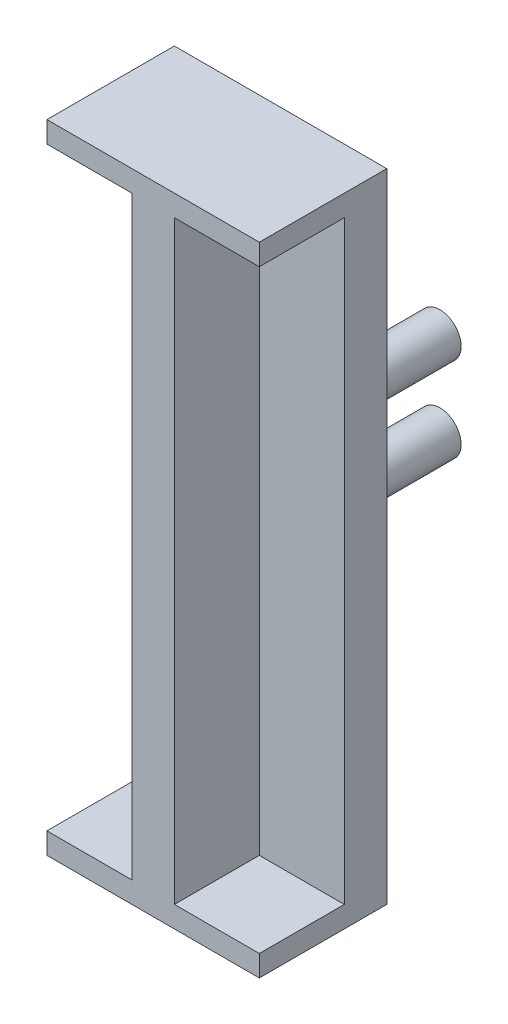
ISO-10303-21;
HEADER;
FILE_DESCRIPTION(('STEP AP214'),'2;1');
FILE_NAME('part.step','',(''),(''),'','','');
FILE_SCHEMA(('AUTOMOTIVE_DESIGN { 1 0 10303 214 1 1 1 1 }'));
ENDSEC;
DATA;
#1=APPLICATION_CONTEXT('core data for automotive mechanical design processes');
#2=APPLICATION_PROTOCOL_DEFINITION('international standard','automotive_design',2000,#1);
#3=PRODUCT_CONTEXT('',#1,'mechanical');
#4=PRODUCT('Part','Part','',(#3));
#5=PRODUCT_RELATED_PRODUCT_CATEGORY('part','',(#4));
#6=PRODUCT_DEFINITION_FORMATION('','',#4);
#7=PRODUCT_DEFINITION_CONTEXT('part definition',#1,'design');
#8=PRODUCT_DEFINITION('design','',#6,#7);
#9=PRODUCT_DEFINITION_SHAPE('','',#8);
#10=(LENGTH_UNIT() NAMED_UNIT(*) SI_UNIT(.MILLI.,.METRE.));
#11=(NAMED_UNIT(*) PLANE_ANGLE_UNIT() SI_UNIT($,.RADIAN.));
#12=(NAMED_UNIT(*) SI_UNIT($,.STERADIAN.) SOLID_ANGLE_UNIT());
#13=UNCERTAINTY_MEASURE_WITH_UNIT(LENGTH_MEASURE(1.E-05),#10,'distance_accuracy_value','');
#14=(GEOMETRIC_REPRESENTATION_CONTEXT(3) GLOBAL_UNCERTAINTY_ASSIGNED_CONTEXT((#13)) GLOBAL_UNIT_ASSIGNED_CONTEXT((#10,
#11,#12)) REPRESENTATION_CONTEXT('',''));
#15=CARTESIAN_POINT('',(0.,0.,0.));
#16=DIRECTION('',(0.,0.,1.));
#17=DIRECTION('',(1.,0.,0.));
#18=AXIS2_PLACEMENT_3D('',#15,#16,#17);
#19=CARTESIAN_POINT('',(0.,0.,2.));
#20=DIRECTION('',(0.,0.,-1.));
#21=DIRECTION('',(-1.,0.,0.));
#22=AXIS2_PLACEMENT_3D('',#19,#20,#21);
#23=PLANE('',#22);
#24=DIRECTION('',(0.,1.,0.));
#25=VECTOR('',#24,1.);
#26=CARTESIAN_POINT('',(5.,15.,2.));
#27=LINE('',#26,#25);
#28=CARTESIAN_POINT('',(5.,-14.,2.));
#29=VERTEX_POINT('',#28);
#30=CARTESIAN_POINT('',(5.,14.,2.));
#31=VERTEX_POINT('',#30);
#32=EDGE_CURVE('E203',#29,#31,#27,.T.);
#33=ORIENTED_EDGE('',*,*,#32,.T.);
#34=DIRECTION('',(-1.,0.,0.));
#35=VECTOR('',#34,1.);
#36=CARTESIAN_POINT('',(0.,14.,2.));
#37=LINE('',#36,#35);
#38=CARTESIAN_POINT('',(1.,14.,2.));
#39=VERTEX_POINT('',#38);
#40=EDGE_CURVE('E49',#31,#39,#37,.T.);
#41=ORIENTED_EDGE('',*,*,#40,.T.);
#42=DIRECTION('',(0.,-1.,0.));
#43=VECTOR('',#42,1.);
#44=CARTESIAN_POINT('',(1.,0.,2.));
#45=LINE('',#44,#43);
#46=CARTESIAN_POINT('',(1.,-14.,2.));
#47=VERTEX_POINT('',#46);
#48=EDGE_CURVE('E54',#39,#47,#45,.T.);
#49=ORIENTED_EDGE('',*,*,#48,.T.);
#50=DIRECTION('',(1.,0.,0.));
#51=VECTOR('',#50,1.);
#52=CARTESIAN_POINT('',(0.,-14.,2.));
#53=LINE('',#52,#51);
#54=EDGE_CURVE('E182',#47,#29,#53,.T.);
#55=ORIENTED_EDGE('',*,*,#54,.T.);
#56=EDGE_LOOP('',(#33,#41,#49,#55));
#57=FACE_BOUND('',#56,.T.);
#58=ADVANCED_FACE('F34',(#57),#23,.F.);
#59=CARTESIAN_POINT('',(-5.,15.,2.));
#60=DIRECTION('',(1.,0.,0.));
#61=DIRECTION('',(0.,1.,0.));
#62=AXIS2_PLACEMENT_3D('',#59,#60,#61);
#63=PLANE('',#62);
#64=DIRECTION('',(0.,-1.,0.));
#65=VECTOR('',#64,1.);
#66=CARTESIAN_POINT('',(-5.,15.,0.));
#67=LINE('',#66,#65);
#68=CARTESIAN_POINT('',(-5.,15.,0.));
#69=VERTEX_POINT('',#68);
#70=CARTESIAN_POINT('',(-5.,-15.,0.));
#71=VERTEX_POINT('',#70);
#72=EDGE_CURVE('E132',#69,#71,#67,.T.);
#73=ORIENTED_EDGE('',*,*,#72,.T.);
#74=DIRECTION('',(0.,0.,-1.));
#75=VECTOR('',#74,1.);
#76=CARTESIAN_POINT('',(-5.,-15.,2.));
#77=LINE('',#76,#75);
#78=CARTESIAN_POINT('',(-5.,-15.,6.));
#79=VERTEX_POINT('',#78);
#80=EDGE_CURVE('E11',#79,#71,#77,.T.);
#81=ORIENTED_EDGE('',*,*,#80,.F.);
#82=DIRECTION('',(0.,-1.,0.));
#83=VECTOR('',#82,1.);
#84=CARTESIAN_POINT('',(-5.,0.,6.));
#85=LINE('',#84,#83);
#86=CARTESIAN_POINT('',(-5.,-14.,6.));
#87=VERTEX_POINT('',#86);
#88=EDGE_CURVE('E156',#87,#79,#85,.T.);
#89=ORIENTED_EDGE('',*,*,#88,.F.);
#90=DIRECTION('',(0.,0.,-1.));
#91=VECTOR('',#90,1.);
#92=CARTESIAN_POINT('',(-5.,-14.,6.));
#93=LINE('',#92,#91);
#94=CARTESIAN_POINT('',(-5.,-14.,2.));
#95=VERTEX_POINT('',#94);
#96=EDGE_CURVE('E197',#87,#95,#93,.T.);
#97=ORIENTED_EDGE('',*,*,#96,.T.);
#98=DIRECTION('',(0.,-1.,0.));
#99=VECTOR('',#98,1.);
#100=CARTESIAN_POINT('',(-5.,15.,2.));
#101=LINE('',#100,#99);
#102=CARTESIAN_POINT('',(-5.,14.,2.));
#103=VERTEX_POINT('',#102);
#104=EDGE_CURVE('E201',#103,#95,#101,.T.);
#105=ORIENTED_EDGE('',*,*,#104,.F.);
#106=DIRECTION('',(0.,0.,-1.));
#107=VECTOR('',#106,1.);
#108=CARTESIAN_POINT('',(-5.,14.,6.));
#109=LINE('',#108,#107);
#110=CARTESIAN_POINT('',(-5.,14.,6.));
#111=VERTEX_POINT('',#110);
#112=EDGE_CURVE('E185',#111,#103,#109,.T.);
#113=ORIENTED_EDGE('',*,*,#112,.F.);
#114=CARTESIAN_POINT('',(-5.,15.,6.));
#115=VERTEX_POINT('',#114);
#116=EDGE_CURVE('E147',#115,#111,#85,.T.);
#117=ORIENTED_EDGE('',*,*,#116,.F.);
#118=DIRECTION('',(0.,0.,-1.));
#119=VECTOR('',#118,1.);
#120=CARTESIAN_POINT('',(-5.,15.,2.));
#121=LINE('',#120,#119);
#122=EDGE_CURVE('E206',#115,#69,#121,.T.);
#123=ORIENTED_EDGE('',*,*,#122,.T.);
#124=EDGE_LOOP('',(#73,#81,#89,#97,#105,#113,#117,#123));
#125=FACE_BOUND('',#124,.T.);
#126=ADVANCED_FACE('F36',(#125),#63,.F.);
#127=CARTESIAN_POINT('',(5.,-15.,2.));
#128=DIRECTION('',(0.,1.,0.));
#129=DIRECTION('',(0.,0.,1.));
#130=AXIS2_PLACEMENT_3D('',#127,#128,#129);
#131=PLANE('',#130);
#132=DIRECTION('',(1.,0.,0.));
#133=VECTOR('',#132,1.);
#134=CARTESIAN_POINT('',(5.,-15.,0.));
#135=LINE('',#134,#133);
#136=CARTESIAN_POINT('',(5.,-15.,0.));
#137=VERTEX_POINT('',#136);
#138=EDGE_CURVE('E209',#71,#137,#135,.T.);
#139=ORIENTED_EDGE('',*,*,#138,.T.);
#140=DIRECTION('',(0.,0.,-1.));
#141=VECTOR('',#140,1.);
#142=CARTESIAN_POINT('',(5.,-15.,2.));
#143=LINE('',#142,#141);
#144=CARTESIAN_POINT('',(5.,-15.,6.));
#145=VERTEX_POINT('',#144);
#146=EDGE_CURVE('E42',#145,#137,#143,.T.);
#147=ORIENTED_EDGE('',*,*,#146,.F.);
#148=DIRECTION('',(1.,0.,0.));
#149=VECTOR('',#148,1.);
#150=CARTESIAN_POINT('',(0.,-15.,6.));
#151=LINE('',#150,#149);
#152=EDGE_CURVE('E159',#79,#145,#151,.T.);
#153=ORIENTED_EDGE('',*,*,#152,.F.);
#154=ORIENTED_EDGE('',*,*,#80,.T.);
#155=EDGE_LOOP('',(#139,#147,#153,#154));
#156=FACE_BOUND('',#155,.T.);
#157=ADVANCED_FACE('F241',(#156),#131,.F.);
#158=CARTESIAN_POINT('',(5.,15.,2.));
#159=DIRECTION('',(-1.,0.,0.));
#160=DIRECTION('',(0.,-1.,0.));
#161=AXIS2_PLACEMENT_3D('',#158,#159,#160);
#162=PLANE('',#161);
#163=DIRECTION('',(0.,1.,0.));
#164=VECTOR('',#163,1.);
#165=CARTESIAN_POINT('',(5.,15.,0.));
#166=LINE('',#165,#164);
#167=CARTESIAN_POINT('',(5.,15.,0.));
#168=VERTEX_POINT('',#167);
#169=EDGE_CURVE('E211',#137,#168,#166,.T.);
#170=ORIENTED_EDGE('',*,*,#169,.T.);
#171=DIRECTION('',(0.,0.,-1.));
#172=VECTOR('',#171,1.);
#173=CARTESIAN_POINT('',(5.,15.,2.));
#174=LINE('',#173,#172);
#175=CARTESIAN_POINT('',(5.,15.,6.));
#176=VERTEX_POINT('',#175);
#177=EDGE_CURVE('E216',#176,#168,#174,.T.);
#178=ORIENTED_EDGE('',*,*,#177,.F.);
#179=DIRECTION('',(0.,1.,0.));
#180=VECTOR('',#179,1.);
#181=CARTESIAN_POINT('',(5.,0.,6.));
#182=LINE('',#181,#180);
#183=CARTESIAN_POINT('',(5.,14.,6.));
#184=VERTEX_POINT('',#183);
#185=EDGE_CURVE('E165',#184,#176,#182,.T.);
#186=ORIENTED_EDGE('',*,*,#185,.F.);
#187=DIRECTION('',(0.,0.,-1.));
#188=VECTOR('',#187,1.);
#189=CARTESIAN_POINT('',(5.,14.,6.));
#190=LINE('',#189,#188);
#191=EDGE_CURVE('E187',#184,#31,#190,.T.);
#192=ORIENTED_EDGE('',*,*,#191,.T.);
#193=ORIENTED_EDGE('',*,*,#32,.F.);
#194=DIRECTION('',(0.,0.,-1.));
#195=VECTOR('',#194,1.);
#196=CARTESIAN_POINT('',(5.,-14.,6.));
#197=LINE('',#196,#195);
#198=CARTESIAN_POINT('',(5.,-14.,6.));
#199=VERTEX_POINT('',#198);
#200=EDGE_CURVE('E194',#199,#29,#197,.T.);
#201=ORIENTED_EDGE('',*,*,#200,.F.);
#202=EDGE_CURVE('E162',#145,#199,#182,.T.);
#203=ORIENTED_EDGE('',*,*,#202,.F.);
#204=ORIENTED_EDGE('',*,*,#146,.T.);
#205=EDGE_LOOP('',(#170,#178,#186,#192,#193,#201,#203,#204));
#206=FACE_BOUND('',#205,.T.);
#207=ADVANCED_FACE('F222',(#206),#162,.F.);
#208=CARTESIAN_POINT('',(5.,15.,2.));
#209=DIRECTION('',(0.,-1.,0.));
#210=DIRECTION('',(0.,0.,-1.));
#211=AXIS2_PLACEMENT_3D('',#208,#209,#210);
#212=PLANE('',#211);
#213=DIRECTION('',(-1.,0.,0.));
#214=VECTOR('',#213,1.);
#215=CARTESIAN_POINT('',(5.,15.,0.));
#216=LINE('',#215,#214);
#217=EDGE_CURVE('E204',#168,#69,#216,.T.);
#218=ORIENTED_EDGE('',*,*,#217,.T.);
#219=ORIENTED_EDGE('',*,*,#122,.F.);
#220=DIRECTION('',(-1.,0.,0.));
#221=VECTOR('',#220,1.);
#222=CARTESIAN_POINT('',(0.,15.,6.));
#223=LINE('',#222,#221);
#224=EDGE_CURVE('E174',#176,#115,#223,.T.);
#225=ORIENTED_EDGE('',*,*,#224,.F.);
#226=ORIENTED_EDGE('',*,*,#177,.T.);
#227=EDGE_LOOP('',(#218,#219,#225,#226));
#228=FACE_BOUND('',#227,.T.);
#229=ADVANCED_FACE('F231',(#228),#212,.F.);
#230=DIRECTION('',(0.,-1.,0.));
#231=VECTOR('',#230,1.);
#232=CARTESIAN_POINT('',(-0.999999999999999,0.,2.));
#233=LINE('',#232,#231);
#234=CARTESIAN_POINT('',(-0.999999999999999,14.,2.));
#235=VERTEX_POINT('',#234);
#236=CARTESIAN_POINT('',(-0.999999999999999,-14.,2.));
#237=VERTEX_POINT('',#236);
#238=EDGE_CURVE('E177',#235,#237,#233,.T.);
#239=ORIENTED_EDGE('',*,*,#238,.F.);
#240=DIRECTION('',(-1.,0.,0.));
#241=VECTOR('',#240,1.);
#242=CARTESIAN_POINT('',(0.,14.,2.));
#243=LINE('',#242,#241);
#244=EDGE_CURVE('E129',#235,#103,#243,.T.);
#245=ORIENTED_EDGE('',*,*,#244,.T.);
#246=ORIENTED_EDGE('',*,*,#104,.T.);
#247=DIRECTION('',(1.,0.,0.));
#248=VECTOR('',#247,1.);
#249=CARTESIAN_POINT('',(0.,-14.,2.));
#250=LINE('',#249,#248);
#251=EDGE_CURVE('E180',#95,#237,#250,.T.);
#252=ORIENTED_EDGE('',*,*,#251,.T.);
#253=EDGE_LOOP('',(#239,#245,#246,#252));
#254=FACE_BOUND('',#253,.T.);
#255=ADVANCED_FACE('F238',(#254),#23,.F.);
#256=CARTESIAN_POINT('',(0.,0.,0.));
#257=DIRECTION('',(0.,0.,-1.));
#258=DIRECTION('',(-1.,0.,0.));
#259=AXIS2_PLACEMENT_3D('',#256,#257,#258);
#260=PLANE('',#259);
#261=CARTESIAN_POINT('',(0.,-2.,0.));
#262=DIRECTION('',(0.,0.,-1.));
#263=DIRECTION('',(-1.,0.,0.));
#264=AXIS2_PLACEMENT_3D('',#261,#262,#263);
#265=CIRCLE('',#264,1.);
#266=CARTESIAN_POINT('',(-1.,-2.,0.));
#267=VERTEX_POINT('',#266);
#268=EDGE_CURVE('E432',#267,#267,#265,.T.);
#269=ORIENTED_EDGE('',*,*,#268,.F.);
#270=EDGE_LOOP('',(#269));
#271=FACE_BOUND('',#270,.T.);
#272=CARTESIAN_POINT('',(0.,2.,0.));
#273=DIRECTION('',(0.,0.,-1.));
#274=DIRECTION('',(-1.,0.,0.));
#275=AXIS2_PLACEMENT_3D('',#272,#273,#274);
#276=CIRCLE('',#275,1.);
#277=CARTESIAN_POINT('',(-1.,2.,0.));
#278=VERTEX_POINT('',#277);
#279=EDGE_CURVE('E152',#278,#278,#276,.T.);
#280=ORIENTED_EDGE('',*,*,#279,.F.);
#281=EDGE_LOOP('',(#280));
#282=FACE_BOUND('',#281,.T.);
#283=ORIENTED_EDGE('',*,*,#72,.F.);
#284=ORIENTED_EDGE('',*,*,#217,.F.);
#285=ORIENTED_EDGE('',*,*,#169,.F.);
#286=ORIENTED_EDGE('',*,*,#138,.F.);
#287=EDGE_LOOP('',(#283,#284,#285,#286));
#288=FACE_BOUND('',#287,.T.);
#289=ADVANCED_FACE('F229',(#271,#282,#288),#260,.T.);
#290=CARTESIAN_POINT('',(0.,14.,6.));
#291=DIRECTION('',(0.,-1.,0.));
#292=DIRECTION('',(0.,0.,-1.));
#293=AXIS2_PLACEMENT_3D('',#290,#291,#292);
#294=PLANE('',#293);
#295=ORIENTED_EDGE('',*,*,#244,.F.);
#296=DIRECTION('',(0.,0.,-1.));
#297=VECTOR('',#296,1.);
#298=CARTESIAN_POINT('',(-0.999999999999999,14.,6.));
#299=LINE('',#298,#297);
#300=CARTESIAN_POINT('',(-0.999999999999999,14.,6.));
#301=VERTEX_POINT('',#300);
#302=EDGE_CURVE('E123',#301,#235,#299,.T.);
#303=ORIENTED_EDGE('',*,*,#302,.F.);
#304=DIRECTION('',(-1.,0.,0.));
#305=VECTOR('',#304,1.);
#306=CARTESIAN_POINT('',(0.,14.,6.));
#307=LINE('',#306,#305);
#308=EDGE_CURVE('E128',#301,#111,#307,.T.);
#309=ORIENTED_EDGE('',*,*,#308,.T.);
#310=ORIENTED_EDGE('',*,*,#112,.T.);
#311=EDGE_LOOP('',(#295,#303,#309,#310));
#312=FACE_BOUND('',#311,.T.);
#313=ADVANCED_FACE('F125',(#312),#294,.T.);
#314=CARTESIAN_POINT('',(-0.999999999999999,0.,6.));
#315=DIRECTION('',(1.,0.,0.));
#316=DIRECTION('',(0.,0.,-1.));
#317=AXIS2_PLACEMENT_3D('',#314,#315,#316);
#318=PLANE('',#317);
#319=ORIENTED_EDGE('',*,*,#238,.T.);
#320=DIRECTION('',(0.,0.,-1.));
#321=VECTOR('',#320,1.);
#322=CARTESIAN_POINT('',(-0.999999999999999,-14.,6.));
#323=LINE('',#322,#321);
#324=CARTESIAN_POINT('',(-0.999999999999999,-14.,6.));
#325=VERTEX_POINT('',#324);
#326=EDGE_CURVE('E133',#325,#237,#323,.T.);
#327=ORIENTED_EDGE('',*,*,#326,.F.);
#328=DIRECTION('',(0.,-1.,0.));
#329=VECTOR('',#328,1.);
#330=CARTESIAN_POINT('',(-0.999999999999999,0.,6.));
#331=LINE('',#330,#329);
#332=EDGE_CURVE('E136',#301,#325,#331,.T.);
#333=ORIENTED_EDGE('',*,*,#332,.F.);
#334=ORIENTED_EDGE('',*,*,#302,.T.);
#335=EDGE_LOOP('',(#319,#327,#333,#334));
#336=FACE_BOUND('',#335,.T.);
#337=ADVANCED_FACE('F137',(#336),#318,.F.);
#338=CARTESIAN_POINT('',(0.,-14.,6.));
#339=DIRECTION('',(0.,1.,0.));
#340=DIRECTION('',(0.,0.,1.));
#341=AXIS2_PLACEMENT_3D('',#338,#339,#340);
#342=PLANE('',#341);
#343=ORIENTED_EDGE('',*,*,#251,.F.);
#344=ORIENTED_EDGE('',*,*,#96,.F.);
#345=DIRECTION('',(1.,0.,0.));
#346=VECTOR('',#345,1.);
#347=CARTESIAN_POINT('',(0.,-14.,6.));
#348=LINE('',#347,#346);
#349=EDGE_CURVE('E142',#87,#325,#348,.T.);
#350=ORIENTED_EDGE('',*,*,#349,.T.);
#351=ORIENTED_EDGE('',*,*,#326,.T.);
#352=EDGE_LOOP('',(#343,#344,#350,#351));
#353=FACE_BOUND('',#352,.T.);
#354=ADVANCED_FACE('F240',(#353),#342,.T.);
#355=CARTESIAN_POINT('',(0.,-14.,6.));
#356=DIRECTION('',(0.,1.,0.));
#357=DIRECTION('',(0.,0.,1.));
#358=AXIS2_PLACEMENT_3D('',#355,#356,#357);
#359=PLANE('',#358);
#360=ORIENTED_EDGE('',*,*,#54,.F.);
#361=DIRECTION('',(0.,0.,-1.));
#362=VECTOR('',#361,1.);
#363=CARTESIAN_POINT('',(1.,-14.,6.));
#364=LINE('',#363,#362);
#365=CARTESIAN_POINT('',(1.,-14.,6.));
#366=VERTEX_POINT('',#365);
#367=EDGE_CURVE('E192',#366,#47,#364,.T.);
#368=ORIENTED_EDGE('',*,*,#367,.F.);
#369=DIRECTION('',(1.,0.,0.));
#370=VECTOR('',#369,1.);
#371=CARTESIAN_POINT('',(0.,-14.,6.));
#372=LINE('',#371,#370);
#373=EDGE_CURVE('E164',#366,#199,#372,.T.);
#374=ORIENTED_EDGE('',*,*,#373,.T.);
#375=ORIENTED_EDGE('',*,*,#200,.T.);
#376=EDGE_LOOP('',(#360,#368,#374,#375));
#377=FACE_BOUND('',#376,.T.);
#378=ADVANCED_FACE('F346',(#377),#359,.T.);
#379=CARTESIAN_POINT('',(1.,0.,6.));
#380=DIRECTION('',(1.,0.,0.));
#381=DIRECTION('',(0.,1.,0.));
#382=AXIS2_PLACEMENT_3D('',#379,#380,#381);
#383=PLANE('',#382);
#384=ORIENTED_EDGE('',*,*,#48,.F.);
#385=DIRECTION('',(0.,0.,-1.));
#386=VECTOR('',#385,1.);
#387=CARTESIAN_POINT('',(1.,14.,6.));
#388=LINE('',#387,#386);
#389=CARTESIAN_POINT('',(1.,14.,6.));
#390=VERTEX_POINT('',#389);
#391=EDGE_CURVE('E190',#390,#39,#388,.T.);
#392=ORIENTED_EDGE('',*,*,#391,.F.);
#393=DIRECTION('',(0.,-1.,0.));
#394=VECTOR('',#393,1.);
#395=CARTESIAN_POINT('',(1.,0.,6.));
#396=LINE('',#395,#394);
#397=EDGE_CURVE('E168',#390,#366,#396,.T.);
#398=ORIENTED_EDGE('',*,*,#397,.T.);
#399=ORIENTED_EDGE('',*,*,#367,.T.);
#400=EDGE_LOOP('',(#384,#392,#398,#399));
#401=FACE_BOUND('',#400,.T.);
#402=ADVANCED_FACE('F355',(#401),#383,.T.);
#403=CARTESIAN_POINT('',(0.,14.,6.));
#404=DIRECTION('',(0.,-1.,0.));
#405=DIRECTION('',(0.,0.,-1.));
#406=AXIS2_PLACEMENT_3D('',#403,#404,#405);
#407=PLANE('',#406);
#408=ORIENTED_EDGE('',*,*,#40,.F.);
#409=ORIENTED_EDGE('',*,*,#191,.F.);
#410=DIRECTION('',(-1.,0.,0.));
#411=VECTOR('',#410,1.);
#412=CARTESIAN_POINT('',(0.,14.,6.));
#413=LINE('',#412,#411);
#414=EDGE_CURVE('E171',#184,#390,#413,.T.);
#415=ORIENTED_EDGE('',*,*,#414,.T.);
#416=ORIENTED_EDGE('',*,*,#391,.T.);
#417=EDGE_LOOP('',(#408,#409,#415,#416));
#418=FACE_BOUND('',#417,.T.);
#419=ADVANCED_FACE('F365',(#418),#407,.T.);
#420=CARTESIAN_POINT('',(0.,0.,6.));
#421=DIRECTION('',(0.,0.,1.));
#422=DIRECTION('',(1.,0.,0.));
#423=AXIS2_PLACEMENT_3D('',#420,#421,#422);
#424=PLANE('',#423);
#425=ORIENTED_EDGE('',*,*,#308,.F.);
#426=ORIENTED_EDGE('',*,*,#332,.T.);
#427=ORIENTED_EDGE('',*,*,#349,.F.);
#428=ORIENTED_EDGE('',*,*,#88,.T.);
#429=ORIENTED_EDGE('',*,*,#152,.T.);
#430=ORIENTED_EDGE('',*,*,#202,.T.);
#431=ORIENTED_EDGE('',*,*,#373,.F.);
#432=ORIENTED_EDGE('',*,*,#397,.F.);
#433=ORIENTED_EDGE('',*,*,#414,.F.);
#434=ORIENTED_EDGE('',*,*,#185,.T.);
#435=ORIENTED_EDGE('',*,*,#224,.T.);
#436=ORIENTED_EDGE('',*,*,#116,.T.);
#437=EDGE_LOOP('',(#425,#426,#427,#428,#429,#430,#431,#432,#433,#434,#435,#436));
#438=FACE_BOUND('',#437,.T.);
#439=ADVANCED_FACE('F144',(#438),#424,.T.);
#440=CARTESIAN_POINT('',(0.,2.,-7.5));
#441=DIRECTION('',(0.,0.,1.));
#442=DIRECTION('',(1.,0.,0.));
#443=AXIS2_PLACEMENT_3D('',#440,#441,#442);
#444=CYLINDRICAL_SURFACE('',#443,1.);
#445=CARTESIAN_POINT('',(0.,2.,-7.5));
#446=DIRECTION('',(0.,0.,-1.));
#447=DIRECTION('',(-1.,0.,0.));
#448=AXIS2_PLACEMENT_3D('',#445,#446,#447);
#449=CIRCLE('',#448,1.);
#450=CARTESIAN_POINT('',(-1.,2.,-7.5));
#451=VERTEX_POINT('',#450);
#452=EDGE_CURVE('E178',#451,#451,#449,.T.);
#453=ORIENTED_EDGE('',*,*,#452,.F.);
#454=EDGE_LOOP('',(#453));
#455=FACE_BOUND('',#454,.T.);
#456=ORIENTED_EDGE('',*,*,#279,.T.);
#457=EDGE_LOOP('',(#456));
#458=FACE_BOUND('',#457,.T.);
#459=ADVANCED_FACE('F383',(#455,#458),#444,.T.);
#460=CARTESIAN_POINT('',(0.,2.,-7.5));
#461=DIRECTION('',(0.,0.,-1.));
#462=DIRECTION('',(-1.,0.,0.));
#463=AXIS2_PLACEMENT_3D('',#460,#461,#462);
#464=PLANE('',#463);
#465=ORIENTED_EDGE('',*,*,#452,.T.);
#466=EDGE_LOOP('',(#465));
#467=FACE_BOUND('',#466,.T.);
#468=ADVANCED_FACE('F395',(#467),#464,.T.);
#469=CARTESIAN_POINT('',(0.,-2.,-7.5));
#470=DIRECTION('',(0.,0.,1.));
#471=DIRECTION('',(1.,0.,0.));
#472=AXIS2_PLACEMENT_3D('',#469,#470,#471);
#473=CYLINDRICAL_SURFACE('',#472,1.);
#474=CARTESIAN_POINT('',(0.,-2.,-7.5));
#475=DIRECTION('',(0.,0.,-1.));
#476=DIRECTION('',(-1.,0.,0.));
#477=AXIS2_PLACEMENT_3D('',#474,#475,#476);
#478=CIRCLE('',#477,1.);
#479=CARTESIAN_POINT('',(-1.,-2.,-7.5));
#480=VERTEX_POINT('',#479);
#481=EDGE_CURVE('E431',#480,#480,#478,.T.);
#482=ORIENTED_EDGE('',*,*,#481,.F.);
#483=EDGE_LOOP('',(#482));
#484=FACE_BOUND('',#483,.T.);
#485=ORIENTED_EDGE('',*,*,#268,.T.);
#486=EDGE_LOOP('',(#485));
#487=FACE_BOUND('',#486,.T.);
#488=ADVANCED_FACE('F405',(#484,#487),#473,.T.);
#489=CARTESIAN_POINT('',(0.,-2.,-7.5));
#490=DIRECTION('',(0.,0.,-1.));
#491=DIRECTION('',(-1.,0.,0.));
#492=AXIS2_PLACEMENT_3D('',#489,#490,#491);
#493=PLANE('',#492);
#494=ORIENTED_EDGE('',*,*,#481,.T.);
#495=EDGE_LOOP('',(#494));
#496=FACE_BOUND('',#495,.T.);
#497=ADVANCED_FACE('F415',(#496),#493,.T.);
#498=CLOSED_SHELL('',(#58,#126,#157,#207,#229,#255,#289,#313,#337,#354,#378,#402,#419,#439,#459,
#468,#488,#497));
#499=MANIFOLD_SOLID_BREP('B2',#498);
#500=ADVANCED_BREP_SHAPE_REPRESENTATION('',(#18,#499),#14);
#501=SHAPE_DEFINITION_REPRESENTATION(#9,#500);
ENDSEC;
END-ISO-10303-21;
